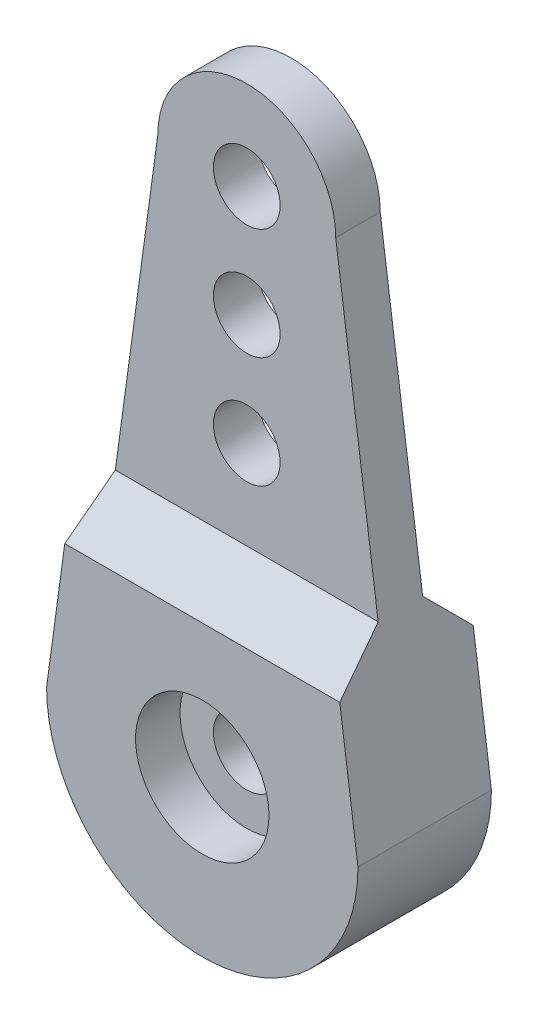
ISO-10303-21;
HEADER;
FILE_DESCRIPTION(('STEP AP214'),'2;1');
FILE_NAME('part.step','',(''),(''),'','','');
FILE_SCHEMA(('AUTOMOTIVE_DESIGN { 1 0 10303 214 1 1 1 1 }'));
ENDSEC;
DATA;
#1=APPLICATION_CONTEXT('core data for automotive mechanical design processes');
#2=APPLICATION_PROTOCOL_DEFINITION('international standard','automotive_design',2000,#1);
#3=PRODUCT_CONTEXT('',#1,'mechanical');
#4=PRODUCT('Part','Part','',(#3));
#5=PRODUCT_RELATED_PRODUCT_CATEGORY('part','',(#4));
#6=PRODUCT_DEFINITION_FORMATION('','',#4);
#7=PRODUCT_DEFINITION_CONTEXT('part definition',#1,'design');
#8=PRODUCT_DEFINITION('design','',#6,#7);
#9=PRODUCT_DEFINITION_SHAPE('','',#8);
#10=(LENGTH_UNIT() NAMED_UNIT(*) SI_UNIT(.MILLI.,.METRE.));
#11=(NAMED_UNIT(*) PLANE_ANGLE_UNIT() SI_UNIT($,.RADIAN.));
#12=(NAMED_UNIT(*) SI_UNIT($,.STERADIAN.) SOLID_ANGLE_UNIT());
#13=UNCERTAINTY_MEASURE_WITH_UNIT(LENGTH_MEASURE(1.E-05),#10,'distance_accuracy_value','');
#14=(GEOMETRIC_REPRESENTATION_CONTEXT(3) GLOBAL_UNCERTAINTY_ASSIGNED_CONTEXT((#13)) GLOBAL_UNIT_ASSIGNED_CONTEXT((#10,
#11,#12)) REPRESENTATION_CONTEXT('',''));
#15=CARTESIAN_POINT('',(0.,0.,0.));
#16=DIRECTION('',(0.,0.,1.));
#17=DIRECTION('',(1.,0.,0.));
#18=AXIS2_PLACEMENT_3D('',#15,#16,#17);
#19=CARTESIAN_POINT('',(0.,0.,1.));
#20=DIRECTION('',(0.,0.,-1.));
#21=DIRECTION('',(-1.,0.,0.));
#22=AXIS2_PLACEMENT_3D('',#19,#20,#21);
#23=CYLINDRICAL_SURFACE('',#22,7.);
#24=DIRECTION('',(0.,0.,-1.));
#25=VECTOR('',#24,1.);
#26=CARTESIAN_POINT('',(-7.,0.,1.));
#27=LINE('',#26,#25);
#28=CARTESIAN_POINT('',(-7.,0.,3.));
#29=VERTEX_POINT('',#28);
#30=CARTESIAN_POINT('',(-7.,0.,-3.));
#31=VERTEX_POINT('',#30);
#32=EDGE_CURVE('E162',#29,#31,#27,.T.);
#33=ORIENTED_EDGE('',*,*,#32,.T.);
#34=CARTESIAN_POINT('',(0.,0.,-3.));
#35=DIRECTION('',(0.,0.,1.));
#36=DIRECTION('',(1.,0.,0.));
#37=AXIS2_PLACEMENT_3D('',#34,#35,#36);
#38=CIRCLE('',#37,7.);
#39=CARTESIAN_POINT('',(7.,0.,-3.));
#40=VERTEX_POINT('',#39);
#41=EDGE_CURVE('E115',#31,#40,#38,.T.);
#42=ORIENTED_EDGE('',*,*,#41,.T.);
#43=DIRECTION('',(0.,0.,-1.));
#44=VECTOR('',#43,1.);
#45=CARTESIAN_POINT('',(7.,0.,1.));
#46=LINE('',#45,#44);
#47=CARTESIAN_POINT('',(7.,0.,3.));
#48=VERTEX_POINT('',#47);
#49=EDGE_CURVE('E109',#48,#40,#46,.T.);
#50=ORIENTED_EDGE('',*,*,#49,.F.);
#51=CARTESIAN_POINT('',(0.,0.,3.));
#52=DIRECTION('',(0.,0.,1.));
#53=DIRECTION('',(1.,0.,0.));
#54=AXIS2_PLACEMENT_3D('',#51,#52,#53);
#55=CIRCLE('',#54,7.);
#56=EDGE_CURVE('E113',#29,#48,#55,.T.);
#57=ORIENTED_EDGE('',*,*,#56,.F.);
#58=EDGE_LOOP('',(#33,#42,#50,#57));
#59=FACE_BOUND('',#58,.T.);
#60=ADVANCED_FACE('F42',(#59),#23,.T.);
#61=CARTESIAN_POINT('',(7.,0.,1.));
#62=DIRECTION('',(-0.990830168044299,-0.135113204733314,0.));
#63=DIRECTION('',(0.135113204733314,-0.990830168044299,0.));
#64=AXIS2_PLACEMENT_3D('',#61,#62,#63);
#65=PLANE('',#64);
#66=DIRECTION('',(-0.135113204733314,0.990830168044299,0.));
#67=VECTOR('',#66,1.);
#68=CARTESIAN_POINT('',(7.,0.,1.));
#69=LINE('',#68,#67);
#70=CARTESIAN_POINT('',(5.90909090909091,8.,1.));
#71=VERTEX_POINT('',#70);
#72=CARTESIAN_POINT('',(4.,22.,1.));
#73=VERTEX_POINT('',#72);
#74=EDGE_CURVE('E154',#71,#73,#69,.T.);
#75=ORIENTED_EDGE('',*,*,#74,.F.);
#76=DIRECTION('',(0.0959785032226471,-0.703842356966079,0.703842356966086));
#77=VECTOR('',#76,1.);
#78=CARTESIAN_POINT('',(6.12487205731832,6.41760491299896,2.58239508700102));
#79=LINE('',#78,#77);
#80=CARTESIAN_POINT('',(6.18181818181818,5.99999999999999,3.));
#81=VERTEX_POINT('',#80);
#82=EDGE_CURVE('E52',#71,#81,#79,.T.);
#83=ORIENTED_EDGE('',*,*,#82,.T.);
#84=DIRECTION('',(-0.135113204733314,0.990830168044299,0.));
#85=VECTOR('',#84,1.);
#86=CARTESIAN_POINT('',(7.,0.,3.));
#87=LINE('',#86,#85);
#88=EDGE_CURVE('E121',#48,#81,#87,.T.);
#89=ORIENTED_EDGE('',*,*,#88,.F.);
#90=ORIENTED_EDGE('',*,*,#49,.T.);
#91=DIRECTION('',(-0.135113204733314,0.990830168044299,0.));
#92=VECTOR('',#91,1.);
#93=CARTESIAN_POINT('',(7.,0.,-3.));
#94=LINE('',#93,#92);
#95=CARTESIAN_POINT('',(6.18181818181819,5.99999999999997,-3.));
#96=VERTEX_POINT('',#95);
#97=EDGE_CURVE('E136',#40,#96,#94,.T.);
#98=ORIENTED_EDGE('',*,*,#97,.T.);
#99=DIRECTION('',(0.0959785032226481,-0.703842356966086,-0.703842356966079));
#100=VECTOR('',#99,1.);
#101=CARTESIAN_POINT('',(5.80022331813529,8.79836233367452,-0.201637666325473));
#102=LINE('',#101,#100);
#103=CARTESIAN_POINT('',(5.90909090909091,8.,-1.));
#104=VERTEX_POINT('',#103);
#105=EDGE_CURVE('E181',#96,#104,#102,.F.);
#106=ORIENTED_EDGE('',*,*,#105,.T.);
#107=DIRECTION('',(-0.135113204733314,0.990830168044299,0.));
#108=VECTOR('',#107,1.);
#109=CARTESIAN_POINT('',(7.,0.,-1.));
#110=LINE('',#109,#108);
#111=CARTESIAN_POINT('',(4.,22.,-1.));
#112=VERTEX_POINT('',#111);
#113=EDGE_CURVE('E153',#104,#112,#110,.T.);
#114=ORIENTED_EDGE('',*,*,#113,.T.);
#115=DIRECTION('',(0.,0.,-1.));
#116=VECTOR('',#115,1.);
#117=CARTESIAN_POINT('',(4.,22.,1.));
#118=LINE('',#117,#116);
#119=EDGE_CURVE('E118',#73,#112,#118,.T.);
#120=ORIENTED_EDGE('',*,*,#119,.F.);
#121=EDGE_LOOP('',(#75,#83,#89,#90,#98,#106,#114,#120));
#122=FACE_BOUND('',#121,.T.);
#123=ADVANCED_FACE('F123',(#122),#65,.F.);
#124=CARTESIAN_POINT('',(0.,22.,1.));
#125=DIRECTION('',(0.,0.,-1.));
#126=DIRECTION('',(-1.,0.,0.));
#127=AXIS2_PLACEMENT_3D('',#124,#125,#126);
#128=CYLINDRICAL_SURFACE('',#127,4.);
#129=CARTESIAN_POINT('',(0.,22.,-1.));
#130=DIRECTION('',(0.,0.,1.));
#131=DIRECTION('',(1.,0.,0.));
#132=AXIS2_PLACEMENT_3D('',#129,#130,#131);
#133=CIRCLE('',#132,4.);
#134=CARTESIAN_POINT('',(-4.,22.,-1.));
#135=VERTEX_POINT('',#134);
#136=EDGE_CURVE('E164',#112,#135,#133,.T.);
#137=ORIENTED_EDGE('',*,*,#136,.T.);
#138=DIRECTION('',(0.,0.,-1.));
#139=VECTOR('',#138,1.);
#140=CARTESIAN_POINT('',(-4.,22.,1.));
#141=LINE('',#140,#139);
#142=CARTESIAN_POINT('',(-4.,22.,1.));
#143=VERTEX_POINT('',#142);
#144=EDGE_CURVE('E168',#143,#135,#141,.T.);
#145=ORIENTED_EDGE('',*,*,#144,.F.);
#146=CARTESIAN_POINT('',(0.,22.,1.));
#147=DIRECTION('',(0.,0.,1.));
#148=DIRECTION('',(1.,0.,0.));
#149=AXIS2_PLACEMENT_3D('',#146,#147,#148);
#150=CIRCLE('',#149,4.);
#151=EDGE_CURVE('E156',#73,#143,#150,.T.);
#152=ORIENTED_EDGE('',*,*,#151,.F.);
#153=ORIENTED_EDGE('',*,*,#119,.T.);
#154=EDGE_LOOP('',(#137,#145,#152,#153));
#155=FACE_BOUND('',#154,.T.);
#156=ADVANCED_FACE('F234',(#155),#128,.T.);
#157=CARTESIAN_POINT('',(-7.,0.,1.));
#158=DIRECTION('',(0.990830168044299,-0.135113204733314,0.));
#159=DIRECTION('',(0.135113204733314,0.990830168044299,0.));
#160=AXIS2_PLACEMENT_3D('',#157,#158,#159);
#161=PLANE('',#160);
#162=DIRECTION('',(-0.135113204733314,-0.990830168044299,0.));
#163=VECTOR('',#162,1.);
#164=CARTESIAN_POINT('',(-5.90909090909091,8.,3.));
#165=LINE('',#164,#163);
#166=CARTESIAN_POINT('',(-6.18181818181818,5.99999999999999,3.));
#167=VERTEX_POINT('',#166);
#168=EDGE_CURVE('E128',#167,#29,#165,.T.);
#169=ORIENTED_EDGE('',*,*,#168,.F.);
#170=DIRECTION('',(0.0959785032226471,0.703842356966079,-0.703842356966086));
#171=VECTOR('',#170,1.);
#172=CARTESIAN_POINT('',(-6.12487205731832,6.41760491299896,2.58239508700102));
#173=LINE('',#172,#171);
#174=CARTESIAN_POINT('',(-5.90909090909091,8.,1.));
#175=VERTEX_POINT('',#174);
#176=EDGE_CURVE('E179',#167,#175,#173,.T.);
#177=ORIENTED_EDGE('',*,*,#176,.T.);
#178=DIRECTION('',(-0.135113204733314,-0.990830168044299,0.));
#179=VECTOR('',#178,1.);
#180=CARTESIAN_POINT('',(-7.,0.,1.));
#181=LINE('',#180,#179);
#182=EDGE_CURVE('E159',#143,#175,#181,.T.);
#183=ORIENTED_EDGE('',*,*,#182,.F.);
#184=ORIENTED_EDGE('',*,*,#144,.T.);
#185=DIRECTION('',(-0.135113204733314,-0.990830168044299,0.));
#186=VECTOR('',#185,1.);
#187=CARTESIAN_POINT('',(-7.,0.,-1.));
#188=LINE('',#187,#186);
#189=CARTESIAN_POINT('',(-5.90909090909091,8.,-1.));
#190=VERTEX_POINT('',#189);
#191=EDGE_CURVE('E157',#135,#190,#188,.T.);
#192=ORIENTED_EDGE('',*,*,#191,.T.);
#193=DIRECTION('',(0.0959785032226481,0.703842356966086,0.703842356966079));
#194=VECTOR('',#193,1.);
#195=CARTESIAN_POINT('',(-5.90909090909091,8.,-0.999999999999986));
#196=LINE('',#195,#194);
#197=CARTESIAN_POINT('',(-6.18181818181819,5.99999999999996,-3.));
#198=VERTEX_POINT('',#197);
#199=EDGE_CURVE('E66',#190,#198,#196,.F.);
#200=ORIENTED_EDGE('',*,*,#199,.T.);
#201=DIRECTION('',(-0.135113204733314,-0.990830168044299,0.));
#202=VECTOR('',#201,1.);
#203=CARTESIAN_POINT('',(-5.90909090909091,8.,-3.));
#204=LINE('',#203,#202);
#205=EDGE_CURVE('E134',#198,#31,#204,.T.);
#206=ORIENTED_EDGE('',*,*,#205,.T.);
#207=ORIENTED_EDGE('',*,*,#32,.F.);
#208=EDGE_LOOP('',(#169,#177,#183,#184,#192,#200,#206,#207));
#209=FACE_BOUND('',#208,.T.);
#210=ADVANCED_FACE('F253',(#209),#161,.F.);
#211=CARTESIAN_POINT('',(0.,0.,1.));
#212=DIRECTION('',(0.,0.,1.));
#213=DIRECTION('',(1.,0.,0.));
#214=AXIS2_PLACEMENT_3D('',#211,#212,#213);
#215=PLANE('',#214);
#216=CARTESIAN_POINT('',(0.,22.,1.));
#217=DIRECTION('',(0.,0.,1.));
#218=DIRECTION('',(1.,0.,0.));
#219=AXIS2_PLACEMENT_3D('',#216,#217,#218);
#220=CIRCLE('',#219,1.5);
#221=CARTESIAN_POINT('',(1.5,22.,1.));
#222=VERTEX_POINT('',#221);
#223=EDGE_CURVE('E188',#222,#222,#220,.T.);
#224=ORIENTED_EDGE('',*,*,#223,.F.);
#225=EDGE_LOOP('',(#224));
#226=FACE_BOUND('',#225,.T.);
#227=CARTESIAN_POINT('',(0.,17.,1.));
#228=DIRECTION('',(0.,0.,1.));
#229=DIRECTION('',(1.,0.,0.));
#230=AXIS2_PLACEMENT_3D('',#227,#228,#229);
#231=CIRCLE('',#230,1.5);
#232=CARTESIAN_POINT('',(1.5,17.,1.));
#233=VERTEX_POINT('',#232);
#234=EDGE_CURVE('E204',#233,#233,#231,.T.);
#235=ORIENTED_EDGE('',*,*,#234,.F.);
#236=EDGE_LOOP('',(#235));
#237=FACE_BOUND('',#236,.T.);
#238=CARTESIAN_POINT('',(0.,12.,1.));
#239=DIRECTION('',(0.,0.,1.));
#240=DIRECTION('',(1.,0.,0.));
#241=AXIS2_PLACEMENT_3D('',#238,#239,#240);
#242=CIRCLE('',#241,1.5);
#243=CARTESIAN_POINT('',(1.5,12.,1.));
#244=VERTEX_POINT('',#243);
#245=EDGE_CURVE('E201',#244,#244,#242,.T.);
#246=ORIENTED_EDGE('',*,*,#245,.F.);
#247=EDGE_LOOP('',(#246));
#248=FACE_BOUND('',#247,.T.);
#249=ORIENTED_EDGE('',*,*,#182,.T.);
#250=DIRECTION('',(1.,0.,0.));
#251=VECTOR('',#250,1.);
#252=CARTESIAN_POINT('',(0.,8.,1.));
#253=LINE('',#252,#251);
#254=EDGE_CURVE('E151',#175,#71,#253,.T.);
#255=ORIENTED_EDGE('',*,*,#254,.T.);
#256=ORIENTED_EDGE('',*,*,#74,.T.);
#257=ORIENTED_EDGE('',*,*,#151,.T.);
#258=EDGE_LOOP('',(#249,#255,#256,#257));
#259=FACE_BOUND('',#258,.T.);
#260=ADVANCED_FACE('F267',(#226,#237,#248,#259),#215,.T.);
#261=CARTESIAN_POINT('',(0.,0.,-1.));
#262=DIRECTION('',(0.,0.,1.));
#263=DIRECTION('',(1.,0.,0.));
#264=AXIS2_PLACEMENT_3D('',#261,#262,#263);
#265=PLANE('',#264);
#266=CARTESIAN_POINT('',(0.,22.,-1.));
#267=DIRECTION('',(0.,0.,1.));
#268=DIRECTION('',(1.,0.,0.));
#269=AXIS2_PLACEMENT_3D('',#266,#267,#268);
#270=CIRCLE('',#269,1.5);
#271=CARTESIAN_POINT('',(1.5,22.,-1.));
#272=VERTEX_POINT('',#271);
#273=EDGE_CURVE('E190',#272,#272,#270,.T.);
#274=ORIENTED_EDGE('',*,*,#273,.T.);
#275=EDGE_LOOP('',(#274));
#276=FACE_BOUND('',#275,.T.);
#277=CARTESIAN_POINT('',(0.,17.,-1.));
#278=DIRECTION('',(0.,0.,1.));
#279=DIRECTION('',(1.,0.,0.));
#280=AXIS2_PLACEMENT_3D('',#277,#278,#279);
#281=CIRCLE('',#280,1.5);
#282=CARTESIAN_POINT('',(1.5,17.,-1.));
#283=VERTEX_POINT('',#282);
#284=EDGE_CURVE('E187',#283,#283,#281,.T.);
#285=ORIENTED_EDGE('',*,*,#284,.T.);
#286=EDGE_LOOP('',(#285));
#287=FACE_BOUND('',#286,.T.);
#288=CARTESIAN_POINT('',(0.,12.,-1.));
#289=DIRECTION('',(0.,0.,1.));
#290=DIRECTION('',(1.,0.,0.));
#291=AXIS2_PLACEMENT_3D('',#288,#289,#290);
#292=CIRCLE('',#291,1.5);
#293=CARTESIAN_POINT('',(1.5,12.,-1.));
#294=VERTEX_POINT('',#293);
#295=EDGE_CURVE('E184',#294,#294,#292,.T.);
#296=ORIENTED_EDGE('',*,*,#295,.T.);
#297=EDGE_LOOP('',(#296));
#298=FACE_BOUND('',#297,.T.);
#299=DIRECTION('',(1.,0.,0.));
#300=VECTOR('',#299,1.);
#301=CARTESIAN_POINT('',(0.,8.,-1.));
#302=LINE('',#301,#300);
#303=EDGE_CURVE('E117',#190,#104,#302,.T.);
#304=ORIENTED_EDGE('',*,*,#303,.F.);
#305=ORIENTED_EDGE('',*,*,#191,.F.);
#306=ORIENTED_EDGE('',*,*,#136,.F.);
#307=ORIENTED_EDGE('',*,*,#113,.F.);
#308=EDGE_LOOP('',(#304,#305,#306,#307));
#309=FACE_BOUND('',#308,.T.);
#310=ADVANCED_FACE('F251',(#276,#287,#298,#309),#265,.F.);
#311=CARTESIAN_POINT('',(0.,0.,-3.));
#312=DIRECTION('',(0.,0.,1.));
#313=DIRECTION('',(1.,0.,0.));
#314=AXIS2_PLACEMENT_3D('',#311,#312,#313);
#315=PLANE('',#314);
#316=ORIENTED_EDGE('',*,*,#205,.F.);
#317=DIRECTION('',(1.,0.,0.));
#318=VECTOR('',#317,1.);
#319=CARTESIAN_POINT('',(0.,5.99999999999997,-3.));
#320=LINE('',#319,#318);
#321=EDGE_CURVE('E11',#198,#96,#320,.T.);
#322=ORIENTED_EDGE('',*,*,#321,.T.);
#323=ORIENTED_EDGE('',*,*,#97,.F.);
#324=ORIENTED_EDGE('',*,*,#41,.F.);
#325=EDGE_LOOP('',(#316,#322,#323,#324));
#326=FACE_BOUND('',#325,.T.);
#327=CARTESIAN_POINT('',(0.,0.,-3.));
#328=DIRECTION('',(0.,0.,1.));
#329=DIRECTION('',(1.,0.,0.));
#330=AXIS2_PLACEMENT_3D('',#327,#328,#329);
#331=CIRCLE('',#330,3.);
#332=CARTESIAN_POINT('',(3.,0.,-3.));
#333=VERTEX_POINT('',#332);
#334=EDGE_CURVE('E139',#333,#333,#331,.T.);
#335=ORIENTED_EDGE('',*,*,#334,.T.);
#336=EDGE_LOOP('',(#335));
#337=FACE_BOUND('',#336,.T.);
#338=ADVANCED_FACE('F255',(#326,#337),#315,.F.);
#339=CARTESIAN_POINT('',(0.,0.,3.));
#340=DIRECTION('',(0.,0.,-1.));
#341=DIRECTION('',(-1.,0.,0.));
#342=AXIS2_PLACEMENT_3D('',#339,#340,#341);
#343=CYLINDRICAL_SURFACE('',#342,3.);
#344=ORIENTED_EDGE('',*,*,#334,.F.);
#345=EDGE_LOOP('',(#344));
#346=FACE_BOUND('',#345,.T.);
#347=CARTESIAN_POINT('',(0.,0.,-1.));
#348=DIRECTION('',(0.,0.,1.));
#349=DIRECTION('',(1.,0.,0.));
#350=AXIS2_PLACEMENT_3D('',#347,#348,#349);
#351=CIRCLE('',#350,3.);
#352=CARTESIAN_POINT('',(3.,0.,-1.));
#353=VERTEX_POINT('',#352);
#354=EDGE_CURVE('E143',#353,#353,#351,.F.);
#355=ORIENTED_EDGE('',*,*,#354,.F.);
#356=EDGE_LOOP('',(#355));
#357=FACE_BOUND('',#356,.T.);
#358=ADVANCED_FACE('F287',(#346,#357),#343,.F.);
#359=CARTESIAN_POINT('',(0.,0.,3.));
#360=DIRECTION('',(0.,0.,1.));
#361=DIRECTION('',(1.,0.,0.));
#362=AXIS2_PLACEMENT_3D('',#359,#360,#361);
#363=PLANE('',#362);
#364=ORIENTED_EDGE('',*,*,#88,.T.);
#365=DIRECTION('',(-1.,0.,0.));
#366=VECTOR('',#365,1.);
#367=CARTESIAN_POINT('',(-5.90909090909091,5.99999999999999,3.));
#368=LINE('',#367,#366);
#369=EDGE_CURVE('E150',#81,#167,#368,.T.);
#370=ORIENTED_EDGE('',*,*,#369,.T.);
#371=ORIENTED_EDGE('',*,*,#168,.T.);
#372=ORIENTED_EDGE('',*,*,#56,.T.);
#373=EDGE_LOOP('',(#364,#370,#371,#372));
#374=FACE_BOUND('',#373,.T.);
#375=CARTESIAN_POINT('',(0.,0.,3.));
#376=DIRECTION('',(0.,0.,1.));
#377=DIRECTION('',(1.,0.,0.));
#378=AXIS2_PLACEMENT_3D('',#375,#376,#377);
#379=CIRCLE('',#378,3.);
#380=CARTESIAN_POINT('',(3.,0.,3.));
#381=VERTEX_POINT('',#380);
#382=EDGE_CURVE('E145',#381,#381,#379,.T.);
#383=ORIENTED_EDGE('',*,*,#382,.F.);
#384=EDGE_LOOP('',(#383));
#385=FACE_BOUND('',#384,.T.);
#386=ADVANCED_FACE('F130',(#374,#385),#363,.T.);
#387=CARTESIAN_POINT('',(0.,0.,1.));
#388=DIRECTION('',(0.,0.,1.));
#389=DIRECTION('',(1.,0.,0.));
#390=AXIS2_PLACEMENT_3D('',#387,#388,#389);
#391=CIRCLE('',#390,3.);
#392=CARTESIAN_POINT('',(3.,0.,1.));
#393=VERTEX_POINT('',#392);
#394=EDGE_CURVE('E147',#393,#393,#391,.F.);
#395=ORIENTED_EDGE('',*,*,#394,.T.);
#396=EDGE_LOOP('',(#395));
#397=FACE_BOUND('',#396,.T.);
#398=ORIENTED_EDGE('',*,*,#382,.T.);
#399=EDGE_LOOP('',(#398));
#400=FACE_BOUND('',#399,.T.);
#401=ADVANCED_FACE('F280',(#397,#400),#343,.F.);
#402=CARTESIAN_POINT('',(0.,0.,1.));
#403=DIRECTION('',(0.,0.,1.));
#404=DIRECTION('',(1.,0.,0.));
#405=AXIS2_PLACEMENT_3D('',#402,#403,#404);
#406=CIRCLE('',#405,1.5);
#407=CARTESIAN_POINT('',(1.5,0.,1.));
#408=VERTEX_POINT('',#407);
#409=EDGE_CURVE('E209',#408,#408,#406,.T.);
#410=ORIENTED_EDGE('',*,*,#409,.F.);
#411=EDGE_LOOP('',(#410));
#412=FACE_BOUND('',#411,.T.);
#413=ORIENTED_EDGE('',*,*,#394,.F.);
#414=EDGE_LOOP('',(#413));
#415=FACE_BOUND('',#414,.T.);
#416=ADVANCED_FACE('F249',(#412,#415),#215,.T.);
#417=CARTESIAN_POINT('',(0.,0.,-1.));
#418=DIRECTION('',(0.,0.,1.));
#419=DIRECTION('',(1.,0.,0.));
#420=AXIS2_PLACEMENT_3D('',#417,#418,#419);
#421=CIRCLE('',#420,1.5);
#422=CARTESIAN_POINT('',(1.5,0.,-1.));
#423=VERTEX_POINT('',#422);
#424=EDGE_CURVE('E47',#423,#423,#421,.T.);
#425=ORIENTED_EDGE('',*,*,#424,.T.);
#426=EDGE_LOOP('',(#425));
#427=FACE_BOUND('',#426,.T.);
#428=ORIENTED_EDGE('',*,*,#354,.T.);
#429=EDGE_LOOP('',(#428));
#430=FACE_BOUND('',#429,.T.);
#431=ADVANCED_FACE('F216',(#427,#430),#265,.F.);
#432=CARTESIAN_POINT('',(0.,5.99999999999999,3.));
#433=DIRECTION('',(0.,0.707106781186551,0.707106781186544));
#434=DIRECTION('',(1.,0.,0.));
#435=AXIS2_PLACEMENT_3D('',#432,#433,#434);
#436=PLANE('',#435);
#437=ORIENTED_EDGE('',*,*,#82,.F.);
#438=ORIENTED_EDGE('',*,*,#254,.F.);
#439=ORIENTED_EDGE('',*,*,#176,.F.);
#440=ORIENTED_EDGE('',*,*,#369,.F.);
#441=EDGE_LOOP('',(#437,#438,#439,#440));
#442=FACE_BOUND('',#441,.T.);
#443=ADVANCED_FACE('F238',(#442),#436,.T.);
#444=CARTESIAN_POINT('',(-5.90909090909091,8.,-0.999999999999986));
#445=DIRECTION('',(0.,-0.707106781186544,0.707106781186551));
#446=DIRECTION('',(-1.,0.,0.));
#447=AXIS2_PLACEMENT_3D('',#444,#445,#446);
#448=PLANE('',#447);
#449=ORIENTED_EDGE('',*,*,#105,.F.);
#450=ORIENTED_EDGE('',*,*,#321,.F.);
#451=ORIENTED_EDGE('',*,*,#199,.F.);
#452=ORIENTED_EDGE('',*,*,#303,.T.);
#453=EDGE_LOOP('',(#449,#450,#451,#452));
#454=FACE_BOUND('',#453,.T.);
#455=ADVANCED_FACE('F45',(#454),#448,.F.);
#456=CARTESIAN_POINT('',(0.,12.,-3.));
#457=DIRECTION('',(0.,0.,1.));
#458=DIRECTION('',(1.,0.,0.));
#459=AXIS2_PLACEMENT_3D('',#456,#457,#458);
#460=CYLINDRICAL_SURFACE('',#459,1.5);
#461=ORIENTED_EDGE('',*,*,#245,.T.);
#462=EDGE_LOOP('',(#461));
#463=FACE_BOUND('',#462,.T.);
#464=ORIENTED_EDGE('',*,*,#295,.F.);
#465=EDGE_LOOP('',(#464));
#466=FACE_BOUND('',#465,.T.);
#467=ADVANCED_FACE('F247',(#463,#466),#460,.F.);
#468=CARTESIAN_POINT('',(0.,17.,-3.));
#469=DIRECTION('',(0.,0.,1.));
#470=DIRECTION('',(1.,0.,0.));
#471=AXIS2_PLACEMENT_3D('',#468,#469,#470);
#472=CYLINDRICAL_SURFACE('',#471,1.5);
#473=ORIENTED_EDGE('',*,*,#234,.T.);
#474=EDGE_LOOP('',(#473));
#475=FACE_BOUND('',#474,.T.);
#476=ORIENTED_EDGE('',*,*,#284,.F.);
#477=EDGE_LOOP('',(#476));
#478=FACE_BOUND('',#477,.T.);
#479=ADVANCED_FACE('F226',(#475,#478),#472,.F.);
#480=CARTESIAN_POINT('',(0.,22.,-3.));
#481=DIRECTION('',(0.,0.,1.));
#482=DIRECTION('',(1.,0.,0.));
#483=AXIS2_PLACEMENT_3D('',#480,#481,#482);
#484=CYLINDRICAL_SURFACE('',#483,1.5);
#485=ORIENTED_EDGE('',*,*,#223,.T.);
#486=EDGE_LOOP('',(#485));
#487=FACE_BOUND('',#486,.T.);
#488=ORIENTED_EDGE('',*,*,#273,.F.);
#489=EDGE_LOOP('',(#488));
#490=FACE_BOUND('',#489,.T.);
#491=ADVANCED_FACE('F221',(#487,#490),#484,.F.);
#492=CARTESIAN_POINT('',(0.,0.,-3.));
#493=DIRECTION('',(0.,0.,1.));
#494=DIRECTION('',(1.,0.,0.));
#495=AXIS2_PLACEMENT_3D('',#492,#493,#494);
#496=CYLINDRICAL_SURFACE('',#495,1.5);
#497=ORIENTED_EDGE('',*,*,#409,.T.);
#498=EDGE_LOOP('',(#497));
#499=FACE_BOUND('',#498,.T.);
#500=ORIENTED_EDGE('',*,*,#424,.F.);
#501=EDGE_LOOP('',(#500));
#502=FACE_BOUND('',#501,.T.);
#503=ADVANCED_FACE('F219',(#499,#502),#496,.F.);
#504=CLOSED_SHELL('',(#60,#123,#156,#210,#260,#310,#338,#358,#386,#401,#416,#431,#443,#455,#467,
#479,#491,#503));
#505=MANIFOLD_SOLID_BREP('B2',#504);
#506=ADVANCED_BREP_SHAPE_REPRESENTATION('',(#18,#505),#14);
#507=SHAPE_DEFINITION_REPRESENTATION(#9,#506);
ENDSEC;
END-ISO-10303-21;
